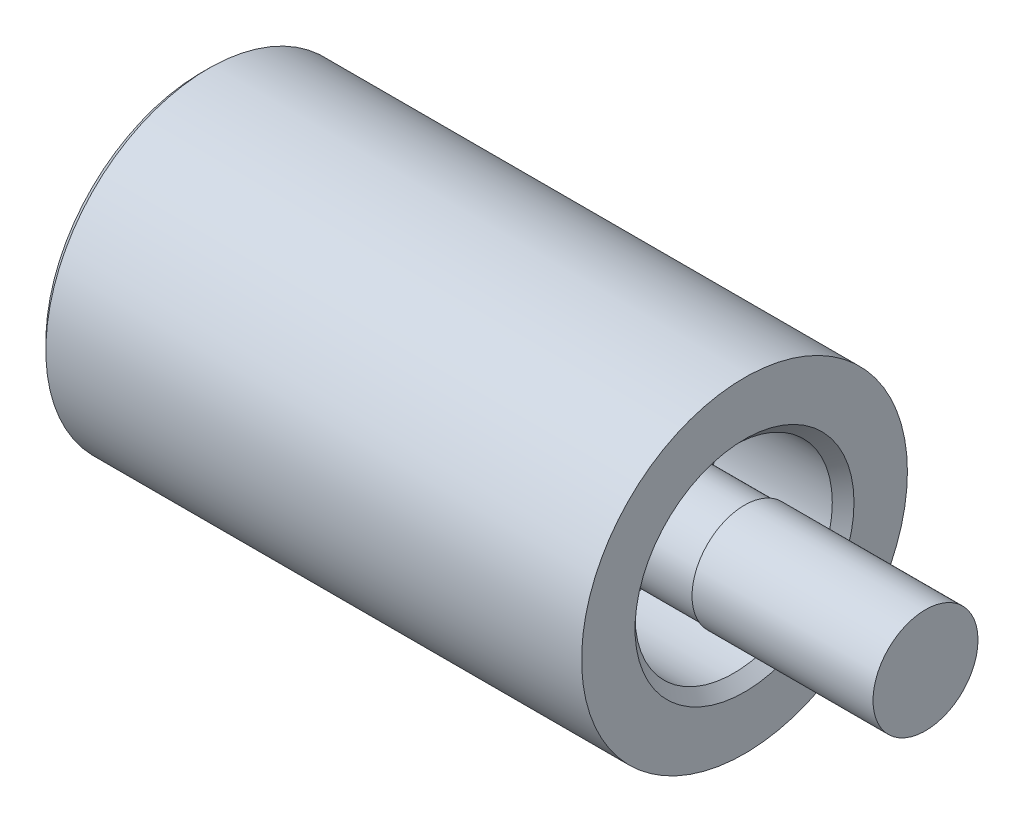
ISO-10303-21;
HEADER;
FILE_DESCRIPTION(('STEP AP214'),'2;1');
FILE_NAME('part.step','',(''),(''),'','','');
FILE_SCHEMA(('AUTOMOTIVE_DESIGN { 1 0 10303 214 1 1 1 1 }'));
ENDSEC;
DATA;
#1=APPLICATION_CONTEXT('core data for automotive mechanical design processes');
#2=APPLICATION_PROTOCOL_DEFINITION('international standard','automotive_design',2000,#1);
#3=PRODUCT_CONTEXT('',#1,'mechanical');
#4=PRODUCT('Part','Part','',(#3));
#5=PRODUCT_RELATED_PRODUCT_CATEGORY('part','',(#4));
#6=PRODUCT_DEFINITION_FORMATION('','',#4);
#7=PRODUCT_DEFINITION_CONTEXT('part definition',#1,'design');
#8=PRODUCT_DEFINITION('design','',#6,#7);
#9=PRODUCT_DEFINITION_SHAPE('','',#8);
#10=(LENGTH_UNIT() NAMED_UNIT(*) SI_UNIT(.MILLI.,.METRE.));
#11=(NAMED_UNIT(*) PLANE_ANGLE_UNIT() SI_UNIT($,.RADIAN.));
#12=(NAMED_UNIT(*) SI_UNIT($,.STERADIAN.) SOLID_ANGLE_UNIT());
#13=UNCERTAINTY_MEASURE_WITH_UNIT(LENGTH_MEASURE(1.E-05),#10,'distance_accuracy_value','');
#14=(GEOMETRIC_REPRESENTATION_CONTEXT(3) GLOBAL_UNCERTAINTY_ASSIGNED_CONTEXT((#13)) GLOBAL_UNIT_ASSIGNED_CONTEXT((#10,
#11,#12)) REPRESENTATION_CONTEXT('',''));
#15=CARTESIAN_POINT('',(0.,0.,0.));
#16=DIRECTION('',(0.,0.,1.));
#17=DIRECTION('',(1.,0.,0.));
#18=AXIS2_PLACEMENT_3D('',#15,#16,#17);
#19=CARTESIAN_POINT('',(-20.,0.,0.));
#20=DIRECTION('',(1.,0.,0.));
#21=DIRECTION('',(0.,0.,-1.));
#22=AXIS2_PLACEMENT_3D('',#19,#20,#21);
#23=CYLINDRICAL_SURFACE('',#22,9.);
#24=CARTESIAN_POINT('',(-19.6,0.,0.));
#25=DIRECTION('',(1.,0.,0.));
#26=DIRECTION('',(0.,0.,-1.));
#27=AXIS2_PLACEMENT_3D('',#24,#25,#26);
#28=CIRCLE('',#27,9.);
#29=CARTESIAN_POINT('',(-19.6,0.,-9.));
#30=VERTEX_POINT('',#29);
#31=EDGE_CURVE('E168',#30,#30,#28,.T.);
#32=ORIENTED_EDGE('',*,*,#31,.T.);
#33=EDGE_LOOP('',(#32));
#34=FACE_BOUND('',#33,.T.);
#35=CARTESIAN_POINT('',(10.,0.,0.));
#36=DIRECTION('',(1.,0.,0.));
#37=DIRECTION('',(0.,0.,-1.));
#38=AXIS2_PLACEMENT_3D('',#35,#36,#37);
#39=CIRCLE('',#38,9.);
#40=CARTESIAN_POINT('',(10.,0.,-9.));
#41=VERTEX_POINT('',#40);
#42=EDGE_CURVE('E133',#41,#41,#39,.T.);
#43=ORIENTED_EDGE('',*,*,#42,.F.);
#44=EDGE_LOOP('',(#43));
#45=FACE_BOUND('',#44,.T.);
#46=ADVANCED_FACE('F51',(#34,#45),#23,.T.);
#47=CARTESIAN_POINT('',(-20.,0.,0.));
#48=DIRECTION('',(1.,0.,0.));
#49=DIRECTION('',(0.,0.,-1.));
#50=AXIS2_PLACEMENT_3D('',#47,#48,#49);
#51=PLANE('',#50);
#52=CARTESIAN_POINT('',(-20.,0.,0.));
#53=DIRECTION('',(1.,0.,0.));
#54=DIRECTION('',(0.,0.,-1.));
#55=AXIS2_PLACEMENT_3D('',#52,#53,#54);
#56=CIRCLE('',#55,8.6);
#57=CARTESIAN_POINT('',(-20.,0.,-8.6));
#58=VERTEX_POINT('',#57);
#59=EDGE_CURVE('E185',#58,#58,#56,.F.);
#60=ORIENTED_EDGE('',*,*,#59,.T.);
#61=EDGE_LOOP('',(#60));
#62=FACE_BOUND('',#61,.T.);
#63=DIRECTION('',(0.,0.,1.));
#64=VECTOR('',#63,1.);
#65=CARTESIAN_POINT('',(-20.,4.8,0.));
#66=LINE('',#65,#64);
#67=CARTESIAN_POINT('',(-20.,4.8,-1.8));
#68=VERTEX_POINT('',#67);
#69=CARTESIAN_POINT('',(-20.,4.8,1.8));
#70=VERTEX_POINT('',#69);
#71=EDGE_CURVE('E172',#68,#70,#66,.T.);
#72=ORIENTED_EDGE('',*,*,#71,.T.);
#73=DIRECTION('',(0.,1.,0.));
#74=VECTOR('',#73,1.);
#75=CARTESIAN_POINT('',(-20.,0.,1.8));
#76=LINE('',#75,#74);
#77=CARTESIAN_POINT('',(-20.,7.38376597678989,1.8));
#78=VERTEX_POINT('',#77);
#79=EDGE_CURVE('E181',#70,#78,#76,.T.);
#80=ORIENTED_EDGE('',*,*,#79,.T.);
#81=CARTESIAN_POINT('',(-20.,0.,0.));
#82=DIRECTION('',(1.,0.,0.));
#83=DIRECTION('',(0.,0.,-1.));
#84=AXIS2_PLACEMENT_3D('',#81,#82,#83);
#85=CIRCLE('',#84,7.6);
#86=CARTESIAN_POINT('',(-20.,7.38376597678989,-1.8));
#87=VERTEX_POINT('',#86);
#88=EDGE_CURVE('E178',#78,#87,#85,.T.);
#89=ORIENTED_EDGE('',*,*,#88,.T.);
#90=DIRECTION('',(0.,-1.,0.));
#91=VECTOR('',#90,1.);
#92=CARTESIAN_POINT('',(-20.,0.,-1.8));
#93=LINE('',#92,#91);
#94=EDGE_CURVE('E175',#87,#68,#93,.T.);
#95=ORIENTED_EDGE('',*,*,#94,.T.);
#96=EDGE_LOOP('',(#72,#80,#89,#95));
#97=FACE_BOUND('',#96,.T.);
#98=ADVANCED_FACE('F286',(#62,#97),#51,.F.);
#99=CARTESIAN_POINT('',(-20.,4.4,2.2));
#100=DIRECTION('',(0.,0.,-1.));
#101=DIRECTION('',(0.,1.,0.));
#102=AXIS2_PLACEMENT_3D('',#99,#100,#101);
#103=PLANE('',#102);
#104=DIRECTION('',(0.,-1.,0.));
#105=VECTOR('',#104,1.);
#106=CARTESIAN_POINT('',(-19.6,4.4,2.2));
#107=LINE('',#106,#105);
#108=CARTESIAN_POINT('',(-19.6,6.85565460040104,2.2));
#109=VERTEX_POINT('',#108);
#110=CARTESIAN_POINT('',(-19.6,4.8,2.2));
#111=VERTEX_POINT('',#110);
#112=EDGE_CURVE('E189',#109,#111,#107,.T.);
#113=ORIENTED_EDGE('',*,*,#112,.T.);
#114=DIRECTION('',(1.,0.,0.));
#115=VECTOR('',#114,1.);
#116=CARTESIAN_POINT('',(-20.,4.8,2.2));
#117=LINE('',#116,#115);
#118=CARTESIAN_POINT('',(0.,4.8,2.2));
#119=VERTEX_POINT('',#118);
#120=EDGE_CURVE('E128',#111,#119,#117,.T.);
#121=ORIENTED_EDGE('',*,*,#120,.T.);
#122=DIRECTION('',(0.,1.,0.));
#123=VECTOR('',#122,1.);
#124=CARTESIAN_POINT('',(0.,4.4,2.2));
#125=LINE('',#124,#123);
#126=CARTESIAN_POINT('',(0.,6.85565460040104,2.2));
#127=VERTEX_POINT('',#126);
#128=EDGE_CURVE('E124',#119,#127,#125,.T.);
#129=ORIENTED_EDGE('',*,*,#128,.T.);
#130=DIRECTION('',(1.,0.,0.));
#131=VECTOR('',#130,1.);
#132=CARTESIAN_POINT('',(-20.,6.85565460040104,2.2));
#133=LINE('',#132,#131);
#134=EDGE_CURVE('E127',#109,#127,#133,.T.);
#135=ORIENTED_EDGE('',*,*,#134,.F.);
#136=EDGE_LOOP('',(#113,#121,#129,#135));
#137=FACE_BOUND('',#136,.T.);
#138=ADVANCED_FACE('F126',(#137),#103,.F.);
#139=CARTESIAN_POINT('',(-20.,4.4,2.2));
#140=DIRECTION('',(0.,1.,0.));
#141=DIRECTION('',(0.,0.,1.));
#142=AXIS2_PLACEMENT_3D('',#139,#140,#141);
#143=PLANE('',#142);
#144=DIRECTION('',(0.,0.,-1.));
#145=VECTOR('',#144,1.);
#146=CARTESIAN_POINT('',(-19.6,4.4,2.2));
#147=LINE('',#146,#145);
#148=CARTESIAN_POINT('',(-19.6,4.4,1.8));
#149=VERTEX_POINT('',#148);
#150=CARTESIAN_POINT('',(-19.6,4.4,-1.8));
#151=VERTEX_POINT('',#150);
#152=EDGE_CURVE('E197',#149,#151,#147,.T.);
#153=ORIENTED_EDGE('',*,*,#152,.T.);
#154=DIRECTION('',(1.,0.,0.));
#155=VECTOR('',#154,1.);
#156=CARTESIAN_POINT('',(-20.,4.4,-1.8));
#157=LINE('',#156,#155);
#158=CARTESIAN_POINT('',(0.,4.4,-1.8));
#159=VERTEX_POINT('',#158);
#160=EDGE_CURVE('E246',#151,#159,#157,.T.);
#161=ORIENTED_EDGE('',*,*,#160,.T.);
#162=DIRECTION('',(0.,0.,1.));
#163=VECTOR('',#162,1.);
#164=CARTESIAN_POINT('',(0.,4.4,2.2));
#165=LINE('',#164,#163);
#166=CARTESIAN_POINT('',(0.,4.4,1.8));
#167=VERTEX_POINT('',#166);
#168=EDGE_CURVE('E143',#159,#167,#165,.T.);
#169=ORIENTED_EDGE('',*,*,#168,.T.);
#170=DIRECTION('',(1.,0.,0.));
#171=VECTOR('',#170,1.);
#172=CARTESIAN_POINT('',(-20.,4.4,1.8));
#173=LINE('',#172,#171);
#174=EDGE_CURVE('E201',#167,#149,#173,.F.);
#175=ORIENTED_EDGE('',*,*,#174,.T.);
#176=EDGE_LOOP('',(#153,#161,#169,#175));
#177=FACE_BOUND('',#176,.T.);
#178=ADVANCED_FACE('F378',(#177),#143,.F.);
#179=CARTESIAN_POINT('',(-20.,4.4,-2.2));
#180=DIRECTION('',(0.,0.,1.));
#181=DIRECTION('',(0.,-1.,0.));
#182=AXIS2_PLACEMENT_3D('',#179,#180,#181);
#183=PLANE('',#182);
#184=DIRECTION('',(0.,-1.,0.));
#185=VECTOR('',#184,1.);
#186=CARTESIAN_POINT('',(0.,4.4,-2.2));
#187=LINE('',#186,#185);
#188=CARTESIAN_POINT('',(0.,6.85565460040104,-2.2));
#189=VERTEX_POINT('',#188);
#190=CARTESIAN_POINT('',(0.,4.8,-2.2));
#191=VERTEX_POINT('',#190);
#192=EDGE_CURVE('E148',#189,#191,#187,.T.);
#193=ORIENTED_EDGE('',*,*,#192,.T.);
#194=DIRECTION('',(1.,0.,0.));
#195=VECTOR('',#194,1.);
#196=CARTESIAN_POINT('',(-20.,4.8,-2.2));
#197=LINE('',#196,#195);
#198=CARTESIAN_POINT('',(-19.6,4.8,-2.2));
#199=VERTEX_POINT('',#198);
#200=EDGE_CURVE('E250',#191,#199,#197,.F.);
#201=ORIENTED_EDGE('',*,*,#200,.T.);
#202=DIRECTION('',(0.,1.,0.));
#203=VECTOR('',#202,1.);
#204=CARTESIAN_POINT('',(-19.6,4.4,-2.2));
#205=LINE('',#204,#203);
#206=CARTESIAN_POINT('',(-19.6,6.85565460040104,-2.2));
#207=VERTEX_POINT('',#206);
#208=EDGE_CURVE('E194',#199,#207,#205,.T.);
#209=ORIENTED_EDGE('',*,*,#208,.T.);
#210=DIRECTION('',(1.,0.,0.));
#211=VECTOR('',#210,1.);
#212=CARTESIAN_POINT('',(-20.,6.85565460040104,-2.2));
#213=LINE('',#212,#211);
#214=EDGE_CURVE('E142',#207,#189,#213,.T.);
#215=ORIENTED_EDGE('',*,*,#214,.T.);
#216=EDGE_LOOP('',(#193,#201,#209,#215));
#217=FACE_BOUND('',#216,.T.);
#218=ADVANCED_FACE('F271',(#217),#183,.F.);
#219=CARTESIAN_POINT('',(-20.,0.,0.));
#220=DIRECTION('',(1.,0.,0.));
#221=DIRECTION('',(0.,0.,-1.));
#222=AXIS2_PLACEMENT_3D('',#219,#220,#221);
#223=CYLINDRICAL_SURFACE('',#222,7.2);
#224=ORIENTED_EDGE('',*,*,#214,.F.);
#225=CARTESIAN_POINT('',(-19.6,0.,0.));
#226=DIRECTION('',(1.,0.,0.));
#227=DIRECTION('',(0.,0.,-1.));
#228=AXIS2_PLACEMENT_3D('',#225,#226,#227);
#229=CIRCLE('',#228,7.2);
#230=EDGE_CURVE('E140',#207,#109,#229,.F.);
#231=ORIENTED_EDGE('',*,*,#230,.T.);
#232=ORIENTED_EDGE('',*,*,#134,.T.);
#233=CARTESIAN_POINT('',(0.,0.,0.));
#234=DIRECTION('',(1.,0.,0.));
#235=DIRECTION('',(0.,0.,-1.));
#236=AXIS2_PLACEMENT_3D('',#233,#234,#235);
#237=CIRCLE('',#236,7.2);
#238=EDGE_CURVE('E132',#127,#189,#237,.T.);
#239=ORIENTED_EDGE('',*,*,#238,.T.);
#240=EDGE_LOOP('',(#224,#231,#232,#239));
#241=FACE_BOUND('',#240,.T.);
#242=ADVANCED_FACE('F138',(#241),#223,.F.);
#243=CARTESIAN_POINT('',(0.,0.,0.));
#244=DIRECTION('',(1.,0.,0.));
#245=DIRECTION('',(0.,0.,-1.));
#246=AXIS2_PLACEMENT_3D('',#243,#244,#245);
#247=PLANE('',#246);
#248=ORIENTED_EDGE('',*,*,#128,.F.);
#249=CARTESIAN_POINT('',(0.,4.8,1.8));
#250=DIRECTION('',(1.,0.,0.));
#251=DIRECTION('',(0.,0.,-1.));
#252=AXIS2_PLACEMENT_3D('',#249,#250,#251);
#253=CIRCLE('',#252,0.4);
#254=EDGE_CURVE('E13',#119,#167,#253,.T.);
#255=ORIENTED_EDGE('',*,*,#254,.T.);
#256=ORIENTED_EDGE('',*,*,#168,.F.);
#257=CARTESIAN_POINT('',(0.,4.8,-1.8));
#258=DIRECTION('',(1.,0.,0.));
#259=DIRECTION('',(0.,0.,-1.));
#260=AXIS2_PLACEMENT_3D('',#257,#258,#259);
#261=CIRCLE('',#260,0.4);
#262=EDGE_CURVE('E60',#159,#191,#261,.T.);
#263=ORIENTED_EDGE('',*,*,#262,.T.);
#264=ORIENTED_EDGE('',*,*,#192,.F.);
#265=ORIENTED_EDGE('',*,*,#238,.F.);
#266=EDGE_LOOP('',(#248,#255,#256,#263,#264,#265));
#267=FACE_BOUND('',#266,.T.);
#268=ADVANCED_FACE('F146',(#267),#247,.F.);
#269=CARTESIAN_POINT('',(10.,0.,0.));
#270=DIRECTION('',(1.,0.,0.));
#271=DIRECTION('',(0.,0.,-1.));
#272=AXIS2_PLACEMENT_3D('',#269,#270,#271);
#273=PLANE('',#272);
#274=CARTESIAN_POINT('',(10.,0.,0.));
#275=DIRECTION('',(1.,0.,0.));
#276=DIRECTION('',(0.,0.,-1.));
#277=AXIS2_PLACEMENT_3D('',#274,#275,#276);
#278=CIRCLE('',#277,6.05);
#279=CARTESIAN_POINT('',(10.,0.,-6.05));
#280=VERTEX_POINT('',#279);
#281=EDGE_CURVE('E164',#280,#280,#278,.F.);
#282=ORIENTED_EDGE('',*,*,#281,.T.);
#283=EDGE_LOOP('',(#282));
#284=FACE_BOUND('',#283,.T.);
#285=ORIENTED_EDGE('',*,*,#42,.T.);
#286=EDGE_LOOP('',(#285));
#287=FACE_BOUND('',#286,.T.);
#288=ADVANCED_FACE('F314',(#284,#287),#273,.T.);
#289=CARTESIAN_POINT('',(3.,0.,0.));
#290=DIRECTION('',(1.,0.,0.));
#291=DIRECTION('',(0.,0.,-1.));
#292=AXIS2_PLACEMENT_3D('',#289,#290,#291);
#293=CYLINDRICAL_SURFACE('',#292,5.45);
#294=CARTESIAN_POINT('',(9.4,0.,0.));
#295=DIRECTION('',(1.,0.,0.));
#296=DIRECTION('',(0.,0.,-1.));
#297=AXIS2_PLACEMENT_3D('',#294,#295,#296);
#298=CIRCLE('',#297,5.45);
#299=CARTESIAN_POINT('',(9.4,0.,-5.45));
#300=VERTEX_POINT('',#299);
#301=EDGE_CURVE('E159',#300,#300,#298,.T.);
#302=ORIENTED_EDGE('',*,*,#301,.T.);
#303=EDGE_LOOP('',(#302));
#304=FACE_BOUND('',#303,.T.);
#305=CARTESIAN_POINT('',(3.,0.,0.));
#306=DIRECTION('',(1.,0.,0.));
#307=DIRECTION('',(0.,0.,-1.));
#308=AXIS2_PLACEMENT_3D('',#305,#306,#307);
#309=CIRCLE('',#308,5.45);
#310=CARTESIAN_POINT('',(3.,0.,-5.45));
#311=VERTEX_POINT('',#310);
#312=EDGE_CURVE('E306',#311,#311,#309,.T.);
#313=ORIENTED_EDGE('',*,*,#312,.F.);
#314=EDGE_LOOP('',(#313));
#315=FACE_BOUND('',#314,.T.);
#316=ADVANCED_FACE('F501',(#304,#315),#293,.F.);
#317=CARTESIAN_POINT('',(3.,0.,0.));
#318=DIRECTION('',(1.,0.,0.));
#319=DIRECTION('',(0.,0.,-1.));
#320=AXIS2_PLACEMENT_3D('',#317,#318,#319);
#321=PLANE('',#320);
#322=CARTESIAN_POINT('',(3.,0.,0.));
#323=DIRECTION('',(1.,0.,0.));
#324=DIRECTION('',(0.,0.,-1.));
#325=AXIS2_PLACEMENT_3D('',#322,#323,#324);
#326=CIRCLE('',#325,2.8);
#327=CARTESIAN_POINT('',(3.,0.,-2.8));
#328=VERTEX_POINT('',#327);
#329=EDGE_CURVE('E302',#328,#328,#326,.T.);
#330=ORIENTED_EDGE('',*,*,#329,.F.);
#331=EDGE_LOOP('',(#330));
#332=FACE_BOUND('',#331,.T.);
#333=ORIENTED_EDGE('',*,*,#312,.T.);
#334=EDGE_LOOP('',(#333));
#335=FACE_BOUND('',#334,.T.);
#336=ADVANCED_FACE('F491',(#332,#335),#321,.T.);
#337=CARTESIAN_POINT('',(3.,0.,0.));
#338=DIRECTION('',(1.,0.,0.));
#339=DIRECTION('',(0.,0.,-1.));
#340=AXIS2_PLACEMENT_3D('',#337,#338,#339);
#341=CYLINDRICAL_SURFACE('',#340,2.8);
#342=ORIENTED_EDGE('',*,*,#329,.T.);
#343=EDGE_LOOP('',(#342));
#344=FACE_BOUND('',#343,.T.);
#345=CARTESIAN_POINT('',(10.,0.,0.));
#346=DIRECTION('',(1.,0.,0.));
#347=DIRECTION('',(0.,0.,-1.));
#348=AXIS2_PLACEMENT_3D('',#345,#346,#347);
#349=CIRCLE('',#348,2.8);
#350=CARTESIAN_POINT('',(10.,0.,-2.8));
#351=VERTEX_POINT('',#350);
#352=EDGE_CURVE('E298',#351,#351,#349,.T.);
#353=ORIENTED_EDGE('',*,*,#352,.F.);
#354=EDGE_LOOP('',(#353));
#355=FACE_BOUND('',#354,.T.);
#356=ADVANCED_FACE('F481',(#344,#355),#341,.T.);
#357=CARTESIAN_POINT('',(20.,0.,0.));
#358=DIRECTION('',(-1.,0.,0.));
#359=DIRECTION('',(0.,0.,1.));
#360=AXIS2_PLACEMENT_3D('',#357,#358,#359);
#361=CYLINDRICAL_SURFACE('',#360,2.9);
#362=CARTESIAN_POINT('',(20.,0.,0.));
#363=DIRECTION('',(1.,0.,0.));
#364=DIRECTION('',(0.,0.,-1.));
#365=AXIS2_PLACEMENT_3D('',#362,#363,#364);
#366=CIRCLE('',#365,2.9);
#367=CARTESIAN_POINT('',(20.,0.,-2.9));
#368=VERTEX_POINT('',#367);
#369=EDGE_CURVE('E294',#368,#368,#366,.T.);
#370=ORIENTED_EDGE('',*,*,#369,.F.);
#371=EDGE_LOOP('',(#370));
#372=FACE_BOUND('',#371,.T.);
#373=CARTESIAN_POINT('',(10.,0.,0.));
#374=DIRECTION('',(1.,0.,0.));
#375=DIRECTION('',(0.,0.,-1.));
#376=AXIS2_PLACEMENT_3D('',#373,#374,#375);
#377=CIRCLE('',#376,2.9);
#378=CARTESIAN_POINT('',(10.,0.,-2.9));
#379=VERTEX_POINT('',#378);
#380=EDGE_CURVE('E243',#379,#379,#377,.T.);
#381=ORIENTED_EDGE('',*,*,#380,.T.);
#382=EDGE_LOOP('',(#381));
#383=FACE_BOUND('',#382,.T.);
#384=ADVANCED_FACE('F471',(#372,#383),#361,.T.);
#385=CARTESIAN_POINT('',(20.,0.,0.));
#386=DIRECTION('',(1.,0.,0.));
#387=DIRECTION('',(0.,0.,-1.));
#388=AXIS2_PLACEMENT_3D('',#385,#386,#387);
#389=PLANE('',#388);
#390=ORIENTED_EDGE('',*,*,#369,.T.);
#391=EDGE_LOOP('',(#390));
#392=FACE_BOUND('',#391,.T.);
#393=ADVANCED_FACE('F461',(#392),#389,.T.);
#394=CARTESIAN_POINT('',(10.,0.,0.));
#395=DIRECTION('',(1.,0.,0.));
#396=DIRECTION('',(0.,0.,-1.));
#397=AXIS2_PLACEMENT_3D('',#394,#395,#396);
#398=PLANE('',#397);
#399=ORIENTED_EDGE('',*,*,#352,.T.);
#400=EDGE_LOOP('',(#399));
#401=FACE_BOUND('',#400,.T.);
#402=ORIENTED_EDGE('',*,*,#380,.F.);
#403=EDGE_LOOP('',(#402));
#404=FACE_BOUND('',#403,.T.);
#405=ADVANCED_FACE('F333',(#401,#404),#398,.F.);
#406=CARTESIAN_POINT('',(9.4,0.,0.));
#407=DIRECTION('',(1.,0.,0.));
#408=DIRECTION('',(0.,0.,-1.));
#409=AXIS2_PLACEMENT_3D('',#406,#407,#408);
#410=CONICAL_SURFACE('',#409,5.45,0.785398163397448);
#411=ORIENTED_EDGE('',*,*,#281,.F.);
#412=EDGE_LOOP('',(#411));
#413=FACE_BOUND('',#412,.T.);
#414=ORIENTED_EDGE('',*,*,#301,.F.);
#415=EDGE_LOOP('',(#414));
#416=FACE_BOUND('',#415,.T.);
#417=ADVANCED_FACE('F327',(#413,#416),#410,.F.);
#418=CARTESIAN_POINT('',(-19.6,0.,0.));
#419=DIRECTION('',(1.,0.,0.));
#420=DIRECTION('',(0.,0.,-1.));
#421=AXIS2_PLACEMENT_3D('',#418,#419,#420);
#422=CONICAL_SURFACE('',#421,9.,0.785398163397446);
#423=ORIENTED_EDGE('',*,*,#59,.F.);
#424=EDGE_LOOP('',(#423));
#425=FACE_BOUND('',#424,.T.);
#426=ORIENTED_EDGE('',*,*,#31,.F.);
#427=EDGE_LOOP('',(#426));
#428=FACE_BOUND('',#427,.T.);
#429=ADVANCED_FACE('F332',(#425,#428),#422,.T.);
#430=CARTESIAN_POINT('',(-20.,0.,-1.8));
#431=DIRECTION('',(0.707106781186547,0.,0.707106781186549));
#432=DIRECTION('',(0.,-1.,0.));
#433=AXIS2_PLACEMENT_3D('',#430,#431,#432);
#434=PLANE('',#433);
#435=ORIENTED_EDGE('',*,*,#208,.F.);
#436=CARTESIAN_POINT('',(-20.,4.8,-1.8));
#437=DIRECTION('',(0.707106781186547,0.,0.707106781186549));
#438=DIRECTION('',(0.707106781186549,0.,-0.707106781186547));
#439=AXIS2_PLACEMENT_3D('',#436,#437,#438);
#440=ELLIPSE('',#439,0.565685424949239,0.4);
#441=CARTESIAN_POINT('',(-19.7171572875254,4.51715728752538,-2.08284271247462));
#442=VERTEX_POINT('',#441);
#443=EDGE_CURVE('E253',#199,#442,#440,.F.);
#444=ORIENTED_EDGE('',*,*,#443,.T.);
#445=DIRECTION('',(0.577350269189627,-0.577350269189626,-0.577350269189625));
#446=VECTOR('',#445,1.);
#447=CARTESIAN_POINT('',(-20.6,5.4,-1.2));
#448=LINE('',#447,#446);
#449=EDGE_CURVE('E239',#68,#442,#448,.T.);
#450=ORIENTED_EDGE('',*,*,#449,.F.);
#451=ORIENTED_EDGE('',*,*,#94,.F.);
#452=CARTESIAN_POINT('',(-20.,7.38376597678989,-1.8));
#453=CARTESIAN_POINT('',(-19.9661045354021,7.34061476846032,-1.83389546459787));
#454=CARTESIAN_POINT('',(-19.9323418894489,7.29725466516294,-1.86765811055112));
#455=CARTESIAN_POINT('',(-19.865096084882,7.21011132025893,-1.93490391511795));
#456=CARTESIAN_POINT('',(-19.8316129026062,7.16632811516786,-1.96838709739377));
#457=CARTESIAN_POINT('',(-19.7649338757546,7.0783255789859,-2.03506612424538));
#458=CARTESIAN_POINT('',(-19.7317380328746,7.03410624532444,-2.0682619671254));
#459=CARTESIAN_POINT('',(-19.6656428975719,6.9452185947706,-2.13435710242811));
#460=CARTESIAN_POINT('',(-19.632743630764,6.90055023978852,-2.16725636923603));
#461=CARTESIAN_POINT('',(-19.6,6.85565460040104,-2.2));
#462=B_SPLINE_CURVE_WITH_KNOTS('',3,(#452,#453,#454,#455,#456,#457,#458,#459,#460,#461),
.UNSPECIFIED.,.F.,.F.,(4,2,2,2,4),(0.,0.19348988974632,0.386963227002388,0.580437705289344,
0.773928736553315),.UNSPECIFIED.);
#463=EDGE_CURVE('E231',#207,#87,#462,.F.);
#464=ORIENTED_EDGE('',*,*,#463,.F.);
#465=EDGE_LOOP('',(#435,#444,#450,#451,#464));
#466=FACE_BOUND('',#465,.T.);
#467=ADVANCED_FACE('F227',(#466),#434,.F.);
#468=CARTESIAN_POINT('',(-20.,4.8,0.));
#469=DIRECTION('',(0.707106781186547,0.707106781186548,0.));
#470=DIRECTION('',(0.,0.,1.));
#471=AXIS2_PLACEMENT_3D('',#468,#469,#470);
#472=PLANE('',#471);
#473=ORIENTED_EDGE('',*,*,#449,.T.);
#474=CARTESIAN_POINT('',(-20.,4.8,-1.8));
#475=DIRECTION('',(0.707106781186547,0.707106781186548,0.));
#476=DIRECTION('',(0.707106781186548,-0.707106781186547,0.));
#477=AXIS2_PLACEMENT_3D('',#474,#475,#476);
#478=ELLIPSE('',#477,0.565685424949239,0.4);
#479=EDGE_CURVE('E259',#442,#151,#478,.F.);
#480=ORIENTED_EDGE('',*,*,#479,.T.);
#481=ORIENTED_EDGE('',*,*,#152,.F.);
#482=CARTESIAN_POINT('',(-20.,4.8,1.8));
#483=DIRECTION('',(0.707106781186547,0.707106781186548,0.));
#484=DIRECTION('',(0.707106781186548,-0.707106781186547,0.));
#485=AXIS2_PLACEMENT_3D('',#482,#483,#484);
#486=ELLIPSE('',#485,0.565685424949239,0.4);
#487=CARTESIAN_POINT('',(-19.7171572875254,4.51715728752538,2.08284271247462));
#488=VERTEX_POINT('',#487);
#489=EDGE_CURVE('E256',#149,#488,#486,.F.);
#490=ORIENTED_EDGE('',*,*,#489,.T.);
#491=DIRECTION('',(-0.577350269189627,0.577350269189626,-0.577350269189625));
#492=VECTOR('',#491,1.);
#493=CARTESIAN_POINT('',(-20.6,5.4,1.2));
#494=LINE('',#493,#492);
#495=EDGE_CURVE('E211',#70,#488,#494,.F.);
#496=ORIENTED_EDGE('',*,*,#495,.F.);
#497=ORIENTED_EDGE('',*,*,#71,.F.);
#498=EDGE_LOOP('',(#473,#480,#481,#490,#496,#497));
#499=FACE_BOUND('',#498,.T.);
#500=ADVANCED_FACE('F225',(#499),#472,.F.);
#501=CARTESIAN_POINT('',(-20.,0.,0.));
#502=DIRECTION('',(-1.,0.,0.));
#503=DIRECTION('',(0.,0.,1.));
#504=AXIS2_PLACEMENT_3D('',#501,#502,#503);
#505=CONICAL_SURFACE('',#504,7.6,0.785398163397447);
#506=ORIENTED_EDGE('',*,*,#463,.T.);
#507=ORIENTED_EDGE('',*,*,#88,.F.);
#508=CARTESIAN_POINT('',(-20.,7.3837659767899,1.8));
#509=CARTESIAN_POINT('',(-19.9661045354021,7.34061476846033,1.83389546459787));
#510=CARTESIAN_POINT('',(-19.9323418894489,7.29725466516295,1.86765811055112));
#511=CARTESIAN_POINT('',(-19.8650960848821,7.21011132025894,1.93490391511795));
#512=CARTESIAN_POINT('',(-19.8316129026062,7.16632811516786,1.96838709739377));
#513=CARTESIAN_POINT('',(-19.7649338757546,7.0783255789859,2.03506612424538));
#514=CARTESIAN_POINT('',(-19.7317380328746,7.03410624532444,2.0682619671254));
#515=CARTESIAN_POINT('',(-19.6656428975719,6.9452185947706,2.13435710242811));
#516=CARTESIAN_POINT('',(-19.632743630764,6.90055023978852,2.16725636923603));
#517=CARTESIAN_POINT('',(-19.6,6.85565460040105,2.2));
#518=B_SPLINE_CURVE_WITH_KNOTS('',3,(#508,#509,#510,#511,#512,#513,#514,#515,#516,#517),
.UNSPECIFIED.,.F.,.F.,(4,2,2,2,4),(0.,0.193489889746318,0.386963227002389,0.580437705289353,
0.773928736553318),.UNSPECIFIED.);
#519=EDGE_CURVE('E202',#109,#78,#518,.F.);
#520=ORIENTED_EDGE('',*,*,#519,.F.);
#521=ORIENTED_EDGE('',*,*,#230,.F.);
#522=EDGE_LOOP('',(#506,#507,#520,#521));
#523=FACE_BOUND('',#522,.T.);
#524=ADVANCED_FACE('F218',(#523),#505,.F.);
#525=CARTESIAN_POINT('',(-20.,0.,1.8));
#526=DIRECTION('',(0.707106781186546,0.,-0.707106781186549));
#527=DIRECTION('',(0.,1.,0.));
#528=AXIS2_PLACEMENT_3D('',#525,#526,#527);
#529=PLANE('',#528);
#530=ORIENTED_EDGE('',*,*,#495,.T.);
#531=CARTESIAN_POINT('',(-20.,4.8,1.8));
#532=DIRECTION('',(0.707106781186546,0.,-0.707106781186549));
#533=DIRECTION('',(0.707106781186549,0.,0.707106781186546));
#534=AXIS2_PLACEMENT_3D('',#531,#532,#533);
#535=ELLIPSE('',#534,0.565685424949239,0.4);
#536=EDGE_CURVE('E73',#488,#111,#535,.F.);
#537=ORIENTED_EDGE('',*,*,#536,.T.);
#538=ORIENTED_EDGE('',*,*,#112,.F.);
#539=ORIENTED_EDGE('',*,*,#519,.T.);
#540=ORIENTED_EDGE('',*,*,#79,.F.);
#541=EDGE_LOOP('',(#530,#537,#538,#539,#540));
#542=FACE_BOUND('',#541,.T.);
#543=ADVANCED_FACE('F214',(#542),#529,.F.);
#544=CARTESIAN_POINT('',(-20.,4.8,-1.8));
#545=DIRECTION('',(1.,0.,0.));
#546=DIRECTION('',(0.,0.,-1.));
#547=AXIS2_PLACEMENT_3D('',#544,#545,#546);
#548=CYLINDRICAL_SURFACE('',#547,0.4);
#549=ORIENTED_EDGE('',*,*,#443,.F.);
#550=ORIENTED_EDGE('',*,*,#200,.F.);
#551=ORIENTED_EDGE('',*,*,#262,.F.);
#552=ORIENTED_EDGE('',*,*,#160,.F.);
#553=ORIENTED_EDGE('',*,*,#479,.F.);
#554=EDGE_LOOP('',(#549,#550,#551,#552,#553));
#555=FACE_BOUND('',#554,.T.);
#556=ADVANCED_FACE('F274',(#555),#548,.T.);
#557=CARTESIAN_POINT('',(-20.,4.8,1.8));
#558=DIRECTION('',(1.,0.,0.));
#559=DIRECTION('',(0.,0.,-1.));
#560=AXIS2_PLACEMENT_3D('',#557,#558,#559);
#561=CYLINDRICAL_SURFACE('',#560,0.4);
#562=ORIENTED_EDGE('',*,*,#489,.F.);
#563=ORIENTED_EDGE('',*,*,#174,.F.);
#564=ORIENTED_EDGE('',*,*,#254,.F.);
#565=ORIENTED_EDGE('',*,*,#120,.F.);
#566=ORIENTED_EDGE('',*,*,#536,.F.);
#567=EDGE_LOOP('',(#562,#563,#564,#565,#566));
#568=FACE_BOUND('',#567,.T.);
#569=ADVANCED_FACE('F53',(#568),#561,.T.);
#570=CLOSED_SHELL('',(#46,#98,#138,#178,#218,#242,#268,#288,#316,#336,#356,#384,#393,#405,#417,
#429,#467,#500,#524,#543,#556,#569));
#571=MANIFOLD_SOLID_BREP('B2',#570);
#572=ADVANCED_BREP_SHAPE_REPRESENTATION('',(#18,#571),#14);
#573=SHAPE_DEFINITION_REPRESENTATION(#9,#572);
ENDSEC;
END-ISO-10303-21;
